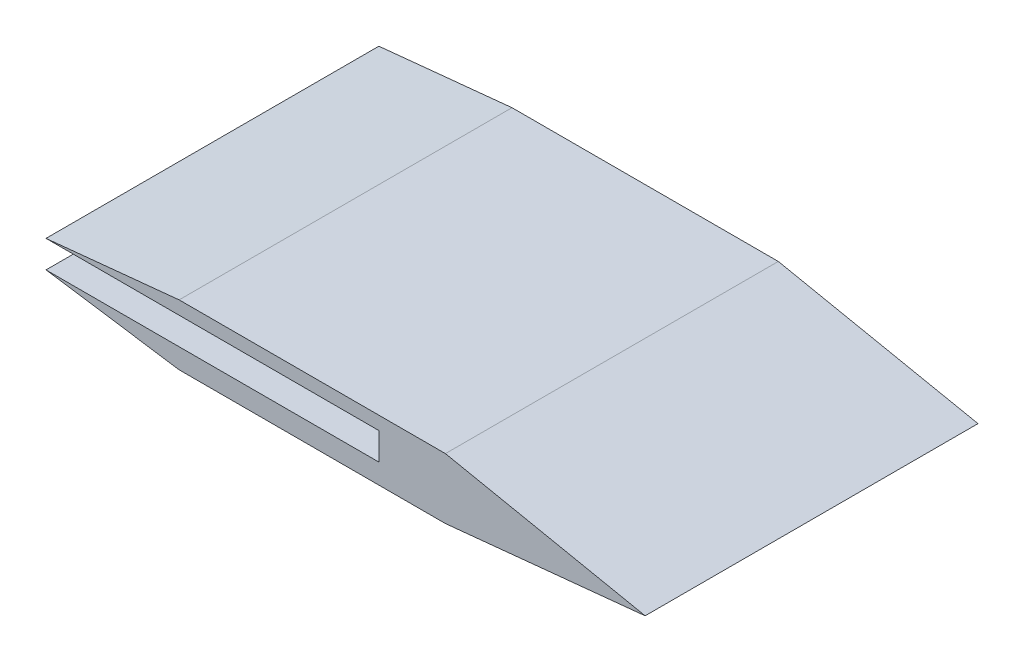
ISO-10303-21;
HEADER;
FILE_DESCRIPTION(('STEP AP214'),'2;1');
FILE_NAME('part.step','',(''),(''),'','','');
FILE_SCHEMA(('AUTOMOTIVE_DESIGN { 1 0 10303 214 1 1 1 1 }'));
ENDSEC;
DATA;
#1=APPLICATION_CONTEXT('core data for automotive mechanical design processes');
#2=APPLICATION_PROTOCOL_DEFINITION('international standard','automotive_design',2000,#1);
#3=PRODUCT_CONTEXT('',#1,'mechanical');
#4=PRODUCT('Part','Part','',(#3));
#5=PRODUCT_RELATED_PRODUCT_CATEGORY('part','',(#4));
#6=PRODUCT_DEFINITION_FORMATION('','',#4);
#7=PRODUCT_DEFINITION_CONTEXT('part definition',#1,'design');
#8=PRODUCT_DEFINITION('design','',#6,#7);
#9=PRODUCT_DEFINITION_SHAPE('','',#8);
#10=(LENGTH_UNIT() NAMED_UNIT(*) SI_UNIT(.MILLI.,.METRE.));
#11=(NAMED_UNIT(*) PLANE_ANGLE_UNIT() SI_UNIT($,.RADIAN.));
#12=(NAMED_UNIT(*) SI_UNIT($,.STERADIAN.) SOLID_ANGLE_UNIT());
#13=UNCERTAINTY_MEASURE_WITH_UNIT(LENGTH_MEASURE(1.E-05),#10,'distance_accuracy_value','');
#14=(GEOMETRIC_REPRESENTATION_CONTEXT(3) GLOBAL_UNCERTAINTY_ASSIGNED_CONTEXT((#13)) GLOBAL_UNIT_ASSIGNED_CONTEXT((#10,
#11,#12)) REPRESENTATION_CONTEXT('',''));
#15=CARTESIAN_POINT('',(0.,0.,0.));
#16=DIRECTION('',(0.,0.,1.));
#17=DIRECTION('',(1.,0.,0.));
#18=AXIS2_PLACEMENT_3D('',#15,#16,#17);
#19=CARTESIAN_POINT('',(50.,0.,50.));
#20=DIRECTION('',(0.,1.,0.));
#21=DIRECTION('',(-1.,0.,0.));
#22=AXIS2_PLACEMENT_3D('',#19,#20,#21);
#23=PLANE('',#22);
#24=DIRECTION('',(1.,0.,0.));
#25=VECTOR('',#24,1.);
#26=CARTESIAN_POINT('',(50.,0.,0.));
#27=LINE('',#26,#25);
#28=CARTESIAN_POINT('',(0.,0.,0.));
#29=VERTEX_POINT('',#28);
#30=CARTESIAN_POINT('',(50.,0.,0.));
#31=VERTEX_POINT('',#30);
#32=EDGE_CURVE('E135',#29,#31,#27,.T.);
#33=ORIENTED_EDGE('',*,*,#32,.T.);
#34=DIRECTION('',(0.,0.,-1.));
#35=VECTOR('',#34,1.);
#36=CARTESIAN_POINT('',(50.,0.,50.));
#37=LINE('',#36,#35);
#38=CARTESIAN_POINT('',(50.,0.,50.));
#39=VERTEX_POINT('',#38);
#40=EDGE_CURVE('E11',#39,#31,#37,.T.);
#41=ORIENTED_EDGE('',*,*,#40,.F.);
#42=DIRECTION('',(1.,0.,0.));
#43=VECTOR('',#42,1.);
#44=CARTESIAN_POINT('',(50.,0.,50.));
#45=LINE('',#44,#43);
#46=CARTESIAN_POINT('',(0.,0.,50.));
#47=VERTEX_POINT('',#46);
#48=EDGE_CURVE('E151',#47,#39,#45,.T.);
#49=ORIENTED_EDGE('',*,*,#48,.F.);
#50=DIRECTION('',(0.,0.,-1.));
#51=VECTOR('',#50,1.);
#52=CARTESIAN_POINT('',(0.,0.,50.));
#53=LINE('',#52,#51);
#54=EDGE_CURVE('E131',#47,#29,#53,.T.);
#55=ORIENTED_EDGE('',*,*,#54,.T.);
#56=EDGE_LOOP('',(#33,#41,#49,#55));
#57=FACE_BOUND('',#56,.T.);
#58=ADVANCED_FACE('F33',(#57),#23,.F.);
#59=CARTESIAN_POINT('',(50.,-4.1,50.));
#60=DIRECTION('',(1.,0.,0.));
#61=DIRECTION('',(0.,0.,-1.));
#62=AXIS2_PLACEMENT_3D('',#59,#60,#61);
#63=PLANE('',#62);
#64=DIRECTION('',(0.,-1.,0.));
#65=VECTOR('',#64,1.);
#66=CARTESIAN_POINT('',(50.,-4.1,0.));
#67=LINE('',#66,#65);
#68=CARTESIAN_POINT('',(50.,-4.1,0.));
#69=VERTEX_POINT('',#68);
#70=EDGE_CURVE('E138',#31,#69,#67,.T.);
#71=ORIENTED_EDGE('',*,*,#70,.T.);
#72=DIRECTION('',(0.,0.,-1.));
#73=VECTOR('',#72,1.);
#74=CARTESIAN_POINT('',(50.,-4.1,50.));
#75=LINE('',#74,#73);
#76=CARTESIAN_POINT('',(50.,-4.1,50.));
#77=VERTEX_POINT('',#76);
#78=EDGE_CURVE('E41',#77,#69,#75,.T.);
#79=ORIENTED_EDGE('',*,*,#78,.F.);
#80=DIRECTION('',(0.,-1.,0.));
#81=VECTOR('',#80,1.);
#82=CARTESIAN_POINT('',(50.,-4.1,50.));
#83=LINE('',#82,#81);
#84=EDGE_CURVE('E95',#39,#77,#83,.T.);
#85=ORIENTED_EDGE('',*,*,#84,.F.);
#86=ORIENTED_EDGE('',*,*,#40,.T.);
#87=EDGE_LOOP('',(#71,#79,#85,#86));
#88=FACE_BOUND('',#87,.T.);
#89=ADVANCED_FACE('F194',(#88),#63,.F.);
#90=CARTESIAN_POINT('',(0.,-4.1,50.));
#91=DIRECTION('',(0.,-1.,0.));
#92=DIRECTION('',(0.,0.,-1.));
#93=AXIS2_PLACEMENT_3D('',#90,#91,#92);
#94=PLANE('',#93);
#95=DIRECTION('',(-1.,0.,0.));
#96=VECTOR('',#95,1.);
#97=CARTESIAN_POINT('',(0.,-4.1,0.));
#98=LINE('',#97,#96);
#99=CARTESIAN_POINT('',(0.,-4.1,0.));
#100=VERTEX_POINT('',#99);
#101=EDGE_CURVE('E140',#69,#100,#98,.T.);
#102=ORIENTED_EDGE('',*,*,#101,.T.);
#103=DIRECTION('',(0.,0.,-1.));
#104=VECTOR('',#103,1.);
#105=CARTESIAN_POINT('',(0.,-4.1,50.));
#106=LINE('',#105,#104);
#107=CARTESIAN_POINT('',(0.,-4.1,50.));
#108=VERTEX_POINT('',#107);
#109=EDGE_CURVE('E161',#108,#100,#106,.T.);
#110=ORIENTED_EDGE('',*,*,#109,.F.);
#111=DIRECTION('',(-1.,0.,0.));
#112=VECTOR('',#111,1.);
#113=CARTESIAN_POINT('',(0.,-4.1,50.));
#114=LINE('',#113,#112);
#115=EDGE_CURVE('E169',#77,#108,#114,.T.);
#116=ORIENTED_EDGE('',*,*,#115,.F.);
#117=ORIENTED_EDGE('',*,*,#78,.T.);
#118=EDGE_LOOP('',(#102,#110,#116,#117));
#119=FACE_BOUND('',#118,.T.);
#120=ADVANCED_FACE('F167',(#119),#94,.F.);
#121=CARTESIAN_POINT('',(20.,-7.1,50.));
#122=DIRECTION('',(0.148340452930245,0.988936352868298,0.));
#123=DIRECTION('',(-0.988936352868298,0.148340452930245,0.));
#124=AXIS2_PLACEMENT_3D('',#121,#122,#123);
#125=PLANE('',#124);
#126=DIRECTION('',(0.988936352868298,-0.148340452930245,0.));
#127=VECTOR('',#126,1.);
#128=CARTESIAN_POINT('',(20.,-7.1,0.));
#129=LINE('',#128,#127);
#130=CARTESIAN_POINT('',(20.,-7.1,0.));
#131=VERTEX_POINT('',#130);
#132=EDGE_CURVE('E142',#100,#131,#129,.T.);
#133=ORIENTED_EDGE('',*,*,#132,.T.);
#134=DIRECTION('',(0.,0.,-1.));
#135=VECTOR('',#134,1.);
#136=CARTESIAN_POINT('',(20.,-7.1,50.));
#137=LINE('',#136,#135);
#138=CARTESIAN_POINT('',(20.,-7.1,50.));
#139=VERTEX_POINT('',#138);
#140=EDGE_CURVE('E158',#139,#131,#137,.T.);
#141=ORIENTED_EDGE('',*,*,#140,.F.);
#142=DIRECTION('',(0.988936352868298,-0.148340452930245,0.));
#143=VECTOR('',#142,1.);
#144=CARTESIAN_POINT('',(20.,-7.1,50.));
#145=LINE('',#144,#143);
#146=EDGE_CURVE('E185',#108,#139,#145,.T.);
#147=ORIENTED_EDGE('',*,*,#146,.F.);
#148=ORIENTED_EDGE('',*,*,#109,.T.);
#149=EDGE_LOOP('',(#133,#141,#147,#148));
#150=FACE_BOUND('',#149,.T.);
#151=ADVANCED_FACE('F178',(#150),#125,.F.);
#152=CARTESIAN_POINT('',(60.,-7.1,50.));
#153=DIRECTION('',(0.,1.,0.));
#154=DIRECTION('',(-1.,0.,0.));
#155=AXIS2_PLACEMENT_3D('',#152,#153,#154);
#156=PLANE('',#155);
#157=DIRECTION('',(1.,0.,0.));
#158=VECTOR('',#157,1.);
#159=CARTESIAN_POINT('',(60.,-7.1,0.));
#160=LINE('',#159,#158);
#161=CARTESIAN_POINT('',(60.,-7.1,0.));
#162=VERTEX_POINT('',#161);
#163=EDGE_CURVE('E144',#131,#162,#160,.T.);
#164=ORIENTED_EDGE('',*,*,#163,.T.);
#165=DIRECTION('',(0.,0.,-1.));
#166=VECTOR('',#165,1.);
#167=CARTESIAN_POINT('',(60.,-7.1,50.));
#168=LINE('',#167,#166);
#169=CARTESIAN_POINT('',(60.,-7.1,50.));
#170=VERTEX_POINT('',#169);
#171=EDGE_CURVE('E155',#170,#162,#168,.T.);
#172=ORIENTED_EDGE('',*,*,#171,.F.);
#173=DIRECTION('',(1.,0.,0.));
#174=VECTOR('',#173,1.);
#175=CARTESIAN_POINT('',(60.,-7.1,50.));
#176=LINE('',#175,#174);
#177=EDGE_CURVE('E184',#139,#170,#176,.T.);
#178=ORIENTED_EDGE('',*,*,#177,.F.);
#179=ORIENTED_EDGE('',*,*,#140,.T.);
#180=EDGE_LOOP('',(#164,#172,#178,#179));
#181=FACE_BOUND('',#180,.T.);
#182=ADVANCED_FACE('F182',(#181),#156,.F.);
#183=CARTESIAN_POINT('',(90.,-4.1,50.));
#184=DIRECTION('',(-0.0995037190209989,0.995037190209989,0.));
#185=DIRECTION('',(-0.995037190209989,-0.0995037190209989,0.));
#186=AXIS2_PLACEMENT_3D('',#183,#184,#185);
#187=PLANE('',#186);
#188=DIRECTION('',(0.995037190209989,0.0995037190209989,0.));
#189=VECTOR('',#188,1.);
#190=CARTESIAN_POINT('',(90.,-4.1,0.));
#191=LINE('',#190,#189);
#192=CARTESIAN_POINT('',(90.,-4.1,0.));
#193=VERTEX_POINT('',#192);
#194=EDGE_CURVE('E146',#162,#193,#191,.T.);
#195=ORIENTED_EDGE('',*,*,#194,.T.);
#196=DIRECTION('',(0.,0.,-1.));
#197=VECTOR('',#196,1.);
#198=CARTESIAN_POINT('',(90.,-4.1,50.));
#199=LINE('',#198,#197);
#200=CARTESIAN_POINT('',(90.,-4.1,50.));
#201=VERTEX_POINT('',#200);
#202=EDGE_CURVE('E126',#201,#193,#199,.T.);
#203=ORIENTED_EDGE('',*,*,#202,.F.);
#204=DIRECTION('',(0.995037190209989,0.0995037190209989,0.));
#205=VECTOR('',#204,1.);
#206=CARTESIAN_POINT('',(90.,-4.1,50.));
#207=LINE('',#206,#205);
#208=EDGE_CURVE('E117',#170,#201,#207,.T.);
#209=ORIENTED_EDGE('',*,*,#208,.F.);
#210=ORIENTED_EDGE('',*,*,#171,.T.);
#211=EDGE_LOOP('',(#195,#203,#209,#210));
#212=FACE_BOUND('',#211,.T.);
#213=ADVANCED_FACE('F206',(#212),#187,.F.);
#214=CARTESIAN_POINT('',(60.,2.,50.));
#215=DIRECTION('',(-0.199255986389241,-0.979947474045446,0.));
#216=DIRECTION('',(0.979947474045447,-0.199255986389241,0.));
#217=AXIS2_PLACEMENT_3D('',#214,#215,#216);
#218=PLANE('',#217);
#219=DIRECTION('',(-0.979947474045446,0.199255986389241,0.));
#220=VECTOR('',#219,1.);
#221=CARTESIAN_POINT('',(60.,2.,0.));
#222=LINE('',#221,#220);
#223=CARTESIAN_POINT('',(60.,2.,0.));
#224=VERTEX_POINT('',#223);
#225=EDGE_CURVE('E125',#193,#224,#222,.T.);
#226=ORIENTED_EDGE('',*,*,#225,.T.);
#227=DIRECTION('',(0.,0.,-1.));
#228=VECTOR('',#227,1.);
#229=CARTESIAN_POINT('',(60.,2.,50.));
#230=LINE('',#229,#228);
#231=CARTESIAN_POINT('',(60.,2.,50.));
#232=VERTEX_POINT('',#231);
#233=EDGE_CURVE('E122',#232,#224,#230,.T.);
#234=ORIENTED_EDGE('',*,*,#233,.F.);
#235=DIRECTION('',(-0.979947474045446,0.199255986389241,0.));
#236=VECTOR('',#235,1.);
#237=CARTESIAN_POINT('',(60.,2.,50.));
#238=LINE('',#237,#236);
#239=EDGE_CURVE('E111',#201,#232,#238,.T.);
#240=ORIENTED_EDGE('',*,*,#239,.F.);
#241=ORIENTED_EDGE('',*,*,#202,.T.);
#242=EDGE_LOOP('',(#226,#234,#240,#241));
#243=FACE_BOUND('',#242,.T.);
#244=ADVANCED_FACE('F123',(#243),#218,.F.);
#245=CARTESIAN_POINT('',(20.,2.,50.));
#246=DIRECTION('',(0.,-1.,0.));
#247=DIRECTION('',(0.,0.,-1.));
#248=AXIS2_PLACEMENT_3D('',#245,#246,#247);
#249=PLANE('',#248);
#250=DIRECTION('',(-1.,0.,0.));
#251=VECTOR('',#250,1.);
#252=CARTESIAN_POINT('',(20.,2.,0.));
#253=LINE('',#252,#251);
#254=CARTESIAN_POINT('',(20.,2.,0.));
#255=VERTEX_POINT('',#254);
#256=EDGE_CURVE('E81',#224,#255,#253,.T.);
#257=ORIENTED_EDGE('',*,*,#256,.T.);
#258=DIRECTION('',(0.,0.,-1.));
#259=VECTOR('',#258,1.);
#260=CARTESIAN_POINT('',(20.,2.,50.));
#261=LINE('',#260,#259);
#262=CARTESIAN_POINT('',(20.,2.,50.));
#263=VERTEX_POINT('',#262);
#264=EDGE_CURVE('E127',#263,#255,#261,.T.);
#265=ORIENTED_EDGE('',*,*,#264,.F.);
#266=DIRECTION('',(-1.,0.,0.));
#267=VECTOR('',#266,1.);
#268=CARTESIAN_POINT('',(20.,2.,50.));
#269=LINE('',#268,#267);
#270=EDGE_CURVE('E115',#232,#263,#269,.T.);
#271=ORIENTED_EDGE('',*,*,#270,.F.);
#272=ORIENTED_EDGE('',*,*,#233,.T.);
#273=EDGE_LOOP('',(#257,#265,#271,#272));
#274=FACE_BOUND('',#273,.T.);
#275=ADVANCED_FACE('F129',(#274),#249,.F.);
#276=CARTESIAN_POINT('',(0.,0.,50.));
#277=DIRECTION('',(0.0995037190209987,-0.995037190209989,0.));
#278=DIRECTION('',(0.995037190209989,0.0995037190209987,0.));
#279=AXIS2_PLACEMENT_3D('',#276,#277,#278);
#280=PLANE('',#279);
#281=DIRECTION('',(-0.995037190209989,-0.0995037190209987,0.));
#282=VECTOR('',#281,1.);
#283=CARTESIAN_POINT('',(0.,0.,0.));
#284=LINE('',#283,#282);
#285=EDGE_CURVE('E87',#255,#29,#284,.T.);
#286=ORIENTED_EDGE('',*,*,#285,.T.);
#287=ORIENTED_EDGE('',*,*,#54,.F.);
#288=DIRECTION('',(-0.995037190209989,-0.0995037190209987,0.));
#289=VECTOR('',#288,1.);
#290=CARTESIAN_POINT('',(0.,0.,50.));
#291=LINE('',#290,#289);
#292=EDGE_CURVE('E49',#263,#47,#291,.T.);
#293=ORIENTED_EDGE('',*,*,#292,.F.);
#294=ORIENTED_EDGE('',*,*,#264,.T.);
#295=EDGE_LOOP('',(#286,#287,#293,#294));
#296=FACE_BOUND('',#295,.T.);
#297=ADVANCED_FACE('F214',(#296),#280,.F.);
#298=CARTESIAN_POINT('',(0.,0.,50.));
#299=DIRECTION('',(0.,0.,-1.));
#300=DIRECTION('',(-1.,0.,0.));
#301=AXIS2_PLACEMENT_3D('',#298,#299,#300);
#302=PLANE('',#301);
#303=ORIENTED_EDGE('',*,*,#48,.T.);
#304=ORIENTED_EDGE('',*,*,#84,.T.);
#305=ORIENTED_EDGE('',*,*,#115,.T.);
#306=ORIENTED_EDGE('',*,*,#146,.T.);
#307=ORIENTED_EDGE('',*,*,#177,.T.);
#308=ORIENTED_EDGE('',*,*,#208,.T.);
#309=ORIENTED_EDGE('',*,*,#239,.T.);
#310=ORIENTED_EDGE('',*,*,#270,.T.);
#311=ORIENTED_EDGE('',*,*,#292,.T.);
#312=EDGE_LOOP('',(#303,#304,#305,#306,#307,#308,#309,#310,#311));
#313=FACE_BOUND('',#312,.T.);
#314=ADVANCED_FACE('F113',(#313),#302,.F.);
#315=CARTESIAN_POINT('',(0.,0.,0.));
#316=DIRECTION('',(0.,0.,-1.));
#317=DIRECTION('',(-1.,0.,0.));
#318=AXIS2_PLACEMENT_3D('',#315,#316,#317);
#319=PLANE('',#318);
#320=ORIENTED_EDGE('',*,*,#32,.F.);
#321=ORIENTED_EDGE('',*,*,#285,.F.);
#322=ORIENTED_EDGE('',*,*,#256,.F.);
#323=ORIENTED_EDGE('',*,*,#225,.F.);
#324=ORIENTED_EDGE('',*,*,#194,.F.);
#325=ORIENTED_EDGE('',*,*,#163,.F.);
#326=ORIENTED_EDGE('',*,*,#132,.F.);
#327=ORIENTED_EDGE('',*,*,#101,.F.);
#328=ORIENTED_EDGE('',*,*,#70,.F.);
#329=EDGE_LOOP('',(#320,#321,#322,#323,#324,#325,#326,#327,#328));
#330=FACE_BOUND('',#329,.T.);
#331=ADVANCED_FACE('F173',(#330),#319,.T.);
#332=CLOSED_SHELL('',(#58,#89,#120,#151,#182,#213,#244,#275,#297,#314,#331));
#333=MANIFOLD_SOLID_BREP('B2',#332);
#334=ADVANCED_BREP_SHAPE_REPRESENTATION('',(#18,#333),#14);
#335=SHAPE_DEFINITION_REPRESENTATION(#9,#334);
ENDSEC;
END-ISO-10303-21;
